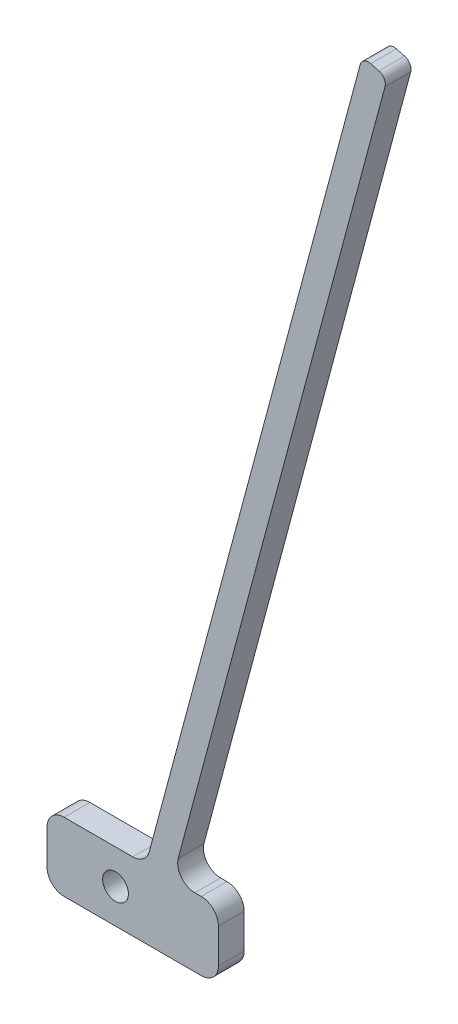
ISO-10303-21;
HEADER;
FILE_DESCRIPTION(('STEP AP214'),'2;1');
FILE_NAME('part.step','',(''),(''),'','','');
FILE_SCHEMA(('AUTOMOTIVE_DESIGN { 1 0 10303 214 1 1 1 1 }'));
ENDSEC;
DATA;
#1=APPLICATION_CONTEXT('core data for automotive mechanical design processes');
#2=APPLICATION_PROTOCOL_DEFINITION('international standard','automotive_design',2000,#1);
#3=PRODUCT_CONTEXT('',#1,'mechanical');
#4=PRODUCT('Part','Part','',(#3));
#5=PRODUCT_RELATED_PRODUCT_CATEGORY('part','',(#4));
#6=PRODUCT_DEFINITION_FORMATION('','',#4);
#7=PRODUCT_DEFINITION_CONTEXT('part definition',#1,'design');
#8=PRODUCT_DEFINITION('design','',#6,#7);
#9=PRODUCT_DEFINITION_SHAPE('','',#8);
#10=(LENGTH_UNIT() NAMED_UNIT(*) SI_UNIT(.MILLI.,.METRE.));
#11=(NAMED_UNIT(*) PLANE_ANGLE_UNIT() SI_UNIT($,.RADIAN.));
#12=(NAMED_UNIT(*) SI_UNIT($,.STERADIAN.) SOLID_ANGLE_UNIT());
#13=UNCERTAINTY_MEASURE_WITH_UNIT(LENGTH_MEASURE(1.E-05),#10,'distance_accuracy_value','');
#14=(GEOMETRIC_REPRESENTATION_CONTEXT(3) GLOBAL_UNCERTAINTY_ASSIGNED_CONTEXT((#13)) GLOBAL_UNIT_ASSIGNED_CONTEXT((#10,
#11,#12)) REPRESENTATION_CONTEXT('',''));
#15=CARTESIAN_POINT('',(0.,0.,0.));
#16=DIRECTION('',(0.,0.,1.));
#17=DIRECTION('',(1.,0.,0.));
#18=AXIS2_PLACEMENT_3D('',#15,#16,#17);
#19=CARTESIAN_POINT('',(-1.53465397595791,2.,3.));
#20=DIRECTION('',(0.,0.,-1.));
#21=DIRECTION('',(-1.,0.,0.));
#22=AXIS2_PLACEMENT_3D('',#19,#20,#21);
#23=PLANE('',#22);
#24=CARTESIAN_POINT('',(-1.53465397595791,2.,3.));
#25=DIRECTION('',(0.,0.,-1.));
#26=DIRECTION('',(-1.,0.,0.));
#27=AXIS2_PLACEMENT_3D('',#24,#25,#26);
#28=CIRCLE('',#27,2.);
#29=CARTESIAN_POINT('',(0.397197676620228,1.48236190979495,3.));
#30=VERTEX_POINT('',#29);
#31=CARTESIAN_POINT('',(-1.53465397595791,0.,3.));
#32=VERTEX_POINT('',#31);
#33=EDGE_CURVE('E236',#30,#32,#28,.T.);
#34=ORIENTED_EDGE('',*,*,#33,.T.);
#35=DIRECTION('',(-1.,0.,0.));
#36=VECTOR('',#35,1.);
#37=CARTESIAN_POINT('',(-1.53465397595791,0.,3.));
#38=LINE('',#37,#36);
#39=CARTESIAN_POINT('',(-9.53465397595791,0.,3.));
#40=VERTEX_POINT('',#39);
#41=EDGE_CURVE('E124',#32,#40,#38,.T.);
#42=ORIENTED_EDGE('',*,*,#41,.T.);
#43=CARTESIAN_POINT('',(-9.53465397595791,-2.,3.));
#44=DIRECTION('',(0.,0.,1.));
#45=DIRECTION('',(-1.,0.,0.));
#46=AXIS2_PLACEMENT_3D('',#43,#44,#45);
#47=CIRCLE('',#46,2.);
#48=CARTESIAN_POINT('',(-11.5346539759579,-2.,3.));
#49=VERTEX_POINT('',#48);
#50=EDGE_CURVE('E289',#40,#49,#47,.T.);
#51=ORIENTED_EDGE('',*,*,#50,.T.);
#52=DIRECTION('',(0.,-1.,0.));
#53=VECTOR('',#52,1.);
#54=CARTESIAN_POINT('',(-11.5346539759579,-2.,3.));
#55=LINE('',#54,#53);
#56=CARTESIAN_POINT('',(-11.5346539759579,-6.,3.));
#57=VERTEX_POINT('',#56);
#58=EDGE_CURVE('E309',#49,#57,#55,.T.);
#59=ORIENTED_EDGE('',*,*,#58,.T.);
#60=CARTESIAN_POINT('',(-9.53465397595791,-6.,3.));
#61=DIRECTION('',(0.,0.,1.));
#62=DIRECTION('',(-1.,0.,0.));
#63=AXIS2_PLACEMENT_3D('',#60,#61,#62);
#64=CIRCLE('',#63,2.);
#65=CARTESIAN_POINT('',(-9.53465397595791,-8.,3.));
#66=VERTEX_POINT('',#65);
#67=EDGE_CURVE('E305',#57,#66,#64,.T.);
#68=ORIENTED_EDGE('',*,*,#67,.T.);
#69=DIRECTION('',(1.,0.,0.));
#70=VECTOR('',#69,1.);
#71=CARTESIAN_POINT('',(-9.53465397595791,-8.,3.));
#72=LINE('',#71,#70);
#73=CARTESIAN_POINT('',(6.46534602404209,-8.,3.));
#74=VERTEX_POINT('',#73);
#75=EDGE_CURVE('E308',#66,#74,#72,.T.);
#76=ORIENTED_EDGE('',*,*,#75,.T.);
#77=CARTESIAN_POINT('',(6.46534602404209,-6.,3.));
#78=DIRECTION('',(0.,0.,1.));
#79=DIRECTION('',(-1.,0.,0.));
#80=AXIS2_PLACEMENT_3D('',#77,#78,#79);
#81=CIRCLE('',#80,2.);
#82=CARTESIAN_POINT('',(8.46534602404209,-6.,3.));
#83=VERTEX_POINT('',#82);
#84=EDGE_CURVE('E313',#74,#83,#81,.T.);
#85=ORIENTED_EDGE('',*,*,#84,.T.);
#86=DIRECTION('',(0.,1.,0.));
#87=VECTOR('',#86,1.);
#88=CARTESIAN_POINT('',(8.46534602404209,-6.,3.));
#89=LINE('',#88,#87);
#90=CARTESIAN_POINT('',(8.46534602404209,-2.,3.));
#91=VERTEX_POINT('',#90);
#92=EDGE_CURVE('E320',#83,#91,#89,.T.);
#93=ORIENTED_EDGE('',*,*,#92,.T.);
#94=CARTESIAN_POINT('',(6.46534602404209,-2.,3.));
#95=DIRECTION('',(0.,0.,1.));
#96=DIRECTION('',(-1.,0.,0.));
#97=AXIS2_PLACEMENT_3D('',#94,#95,#96);
#98=CIRCLE('',#97,2.);
#99=CARTESIAN_POINT('',(6.46534602404209,0.,3.));
#100=VERTEX_POINT('',#99);
#101=EDGE_CURVE('E323',#91,#100,#98,.T.);
#102=ORIENTED_EDGE('',*,*,#101,.T.);
#103=DIRECTION('',(-1.,0.,0.));
#104=VECTOR('',#103,1.);
#105=CARTESIAN_POINT('',(6.46534602404209,0.,3.));
#106=LINE('',#105,#104);
#107=CARTESIAN_POINT('',(5.71227928691264,0.,3.));
#108=VERTEX_POINT('',#107);
#109=EDGE_CURVE('E326',#100,#108,#106,.T.);
#110=ORIENTED_EDGE('',*,*,#109,.T.);
#111=CARTESIAN_POINT('',(5.71227928691264,2.,3.));
#112=DIRECTION('',(0.,0.,-1.));
#113=DIRECTION('',(1.,0.,0.));
#114=AXIS2_PLACEMENT_3D('',#111,#112,#113);
#115=CIRCLE('',#114,2.);
#116=CARTESIAN_POINT('',(3.78042763433451,2.51763809020505,3.));
#117=VERTEX_POINT('',#116);
#118=EDGE_CURVE('E329',#108,#117,#115,.T.);
#119=ORIENTED_EDGE('',*,*,#118,.T.);
#120=DIRECTION('',(0.258819045102525,0.965925826289067,0.));
#121=VECTOR('',#120,1.);
#122=CARTESIAN_POINT('',(3.78042763433451,2.51763809020505,3.));
#123=LINE('',#122,#121);
#124=CARTESIAN_POINT('',(27.8958549531359,92.5176380902051,3.));
#125=VERTEX_POINT('',#124);
#126=EDGE_CURVE('E332',#117,#125,#123,.T.);
#127=ORIENTED_EDGE('',*,*,#126,.T.);
#128=CARTESIAN_POINT('',(26.9299291268469,92.7764571353076,3.));
#129=DIRECTION('',(0.,0.,1.));
#130=DIRECTION('',(1.,0.,0.));
#131=AXIS2_PLACEMENT_3D('',#128,#129,#130);
#132=CIRCLE('',#131,0.999999999999996);
#133=CARTESIAN_POINT('',(27.1887481719494,93.7423829615966,3.));
#134=VERTEX_POINT('',#133);
#135=EDGE_CURVE('E167',#125,#134,#132,.T.);
#136=ORIENTED_EDGE('',*,*,#135,.T.);
#137=DIRECTION('',(-0.965925826289067,0.258819045102524,0.));
#138=VECTOR('',#137,1.);
#139=CARTESIAN_POINT('',(27.1887481719494,93.7423829615966,3.));
#140=LINE('',#139,#138);
#141=CARTESIAN_POINT('',(26.2228223456604,94.0012020066991,3.));
#142=VERTEX_POINT('',#141);
#143=EDGE_CURVE('E161',#134,#142,#140,.T.);
#144=ORIENTED_EDGE('',*,*,#143,.T.);
#145=CARTESIAN_POINT('',(25.9640033005578,93.0352761804101,3.));
#146=DIRECTION('',(0.,0.,1.));
#147=DIRECTION('',(1.,0.,0.));
#148=AXIS2_PLACEMENT_3D('',#145,#146,#147);
#149=CIRCLE('',#148,1.);
#150=CARTESIAN_POINT('',(24.9980774742688,93.2940952255126,3.));
#151=VERTEX_POINT('',#150);
#152=EDGE_CURVE('E165',#142,#151,#149,.T.);
#153=ORIENTED_EDGE('',*,*,#152,.T.);
#154=DIRECTION('',(-0.258819045102525,-0.965925826289067,0.));
#155=VECTOR('',#154,1.);
#156=CARTESIAN_POINT('',(24.9980774742688,93.2940952255126,3.));
#157=LINE('',#156,#155);
#158=EDGE_CURVE('E57',#151,#30,#157,.T.);
#159=ORIENTED_EDGE('',*,*,#158,.T.);
#160=EDGE_LOOP('',(#34,#42,#51,#59,#68,#76,#85,#93,#102,#110,#119,#127,#136,#144,#153,#159));
#161=FACE_BOUND('',#160,.T.);
#162=CARTESIAN_POINT('',(-3.53465397595792,-4.,3.));
#163=DIRECTION('',(0.,0.,1.));
#164=DIRECTION('',(1.,0.,0.));
#165=AXIS2_PLACEMENT_3D('',#162,#163,#164);
#166=CIRCLE('',#165,1.5);
#167=CARTESIAN_POINT('',(-2.03465397595791,-4.,3.));
#168=VERTEX_POINT('',#167);
#169=EDGE_CURVE('E194',#168,#168,#166,.T.);
#170=ORIENTED_EDGE('',*,*,#169,.F.);
#171=EDGE_LOOP('',(#170));
#172=FACE_BOUND('',#171,.T.);
#173=ADVANCED_FACE('F39',(#161,#172),#23,.F.);
#174=CARTESIAN_POINT('',(-1.53465397595791,2.,0.));
#175=DIRECTION('',(0.,0.,-1.));
#176=DIRECTION('',(-1.,0.,0.));
#177=AXIS2_PLACEMENT_3D('',#174,#175,#176);
#178=PLANE('',#177);
#179=CARTESIAN_POINT('',(-1.53465397595791,2.,0.));
#180=DIRECTION('',(0.,0.,-1.));
#181=DIRECTION('',(-1.,0.,0.));
#182=AXIS2_PLACEMENT_3D('',#179,#180,#181);
#183=CIRCLE('',#182,2.);
#184=CARTESIAN_POINT('',(0.397197676620228,1.48236190979495,0.));
#185=VERTEX_POINT('',#184);
#186=CARTESIAN_POINT('',(-1.53465397595791,0.,0.));
#187=VERTEX_POINT('',#186);
#188=EDGE_CURVE('E189',#185,#187,#183,.T.);
#189=ORIENTED_EDGE('',*,*,#188,.F.);
#190=DIRECTION('',(-0.258819045102525,-0.965925826289067,0.));
#191=VECTOR('',#190,1.);
#192=CARTESIAN_POINT('',(24.9980774742688,93.2940952255126,0.));
#193=LINE('',#192,#191);
#194=CARTESIAN_POINT('',(24.9980774742688,93.2940952255126,0.));
#195=VERTEX_POINT('',#194);
#196=EDGE_CURVE('E116',#195,#185,#193,.T.);
#197=ORIENTED_EDGE('',*,*,#196,.F.);
#198=CARTESIAN_POINT('',(25.9640033005578,93.0352761804101,0.));
#199=DIRECTION('',(0.,0.,1.));
#200=DIRECTION('',(1.,0.,0.));
#201=AXIS2_PLACEMENT_3D('',#198,#199,#200);
#202=CIRCLE('',#201,1.);
#203=CARTESIAN_POINT('',(26.2228223456604,94.0012020066991,0.));
#204=VERTEX_POINT('',#203);
#205=EDGE_CURVE('E110',#204,#195,#202,.T.);
#206=ORIENTED_EDGE('',*,*,#205,.F.);
#207=DIRECTION('',(-0.965925826289067,0.258819045102524,0.));
#208=VECTOR('',#207,1.);
#209=CARTESIAN_POINT('',(27.1887481719494,93.7423829615966,0.));
#210=LINE('',#209,#208);
#211=CARTESIAN_POINT('',(27.1887481719494,93.7423829615966,0.));
#212=VERTEX_POINT('',#211);
#213=EDGE_CURVE('E176',#212,#204,#210,.T.);
#214=ORIENTED_EDGE('',*,*,#213,.F.);
#215=CARTESIAN_POINT('',(26.9299291268469,92.7764571353076,0.));
#216=DIRECTION('',(0.,0.,1.));
#217=DIRECTION('',(1.,0.,0.));
#218=AXIS2_PLACEMENT_3D('',#215,#216,#217);
#219=CIRCLE('',#218,0.999999999999996);
#220=CARTESIAN_POINT('',(27.8958549531359,92.5176380902051,0.));
#221=VERTEX_POINT('',#220);
#222=EDGE_CURVE('E227',#221,#212,#219,.T.);
#223=ORIENTED_EDGE('',*,*,#222,.F.);
#224=DIRECTION('',(0.258819045102525,0.965925826289067,0.));
#225=VECTOR('',#224,1.);
#226=CARTESIAN_POINT('',(3.78042763433451,2.51763809020505,0.));
#227=LINE('',#226,#225);
#228=CARTESIAN_POINT('',(3.78042763433451,2.51763809020505,0.));
#229=VERTEX_POINT('',#228);
#230=EDGE_CURVE('E224',#229,#221,#227,.T.);
#231=ORIENTED_EDGE('',*,*,#230,.F.);
#232=CARTESIAN_POINT('',(5.71227928691264,2.,0.));
#233=DIRECTION('',(0.,0.,-1.));
#234=DIRECTION('',(1.,0.,0.));
#235=AXIS2_PLACEMENT_3D('',#232,#233,#234);
#236=CIRCLE('',#235,2.);
#237=CARTESIAN_POINT('',(5.71227928691264,0.,0.));
#238=VERTEX_POINT('',#237);
#239=EDGE_CURVE('E221',#238,#229,#236,.T.);
#240=ORIENTED_EDGE('',*,*,#239,.F.);
#241=DIRECTION('',(-1.,0.,0.));
#242=VECTOR('',#241,1.);
#243=CARTESIAN_POINT('',(6.46534602404209,0.,0.));
#244=LINE('',#243,#242);
#245=CARTESIAN_POINT('',(6.46534602404209,0.,0.));
#246=VERTEX_POINT('',#245);
#247=EDGE_CURVE('E218',#246,#238,#244,.T.);
#248=ORIENTED_EDGE('',*,*,#247,.F.);
#249=CARTESIAN_POINT('',(6.46534602404209,-2.,0.));
#250=DIRECTION('',(0.,0.,1.));
#251=DIRECTION('',(-1.,0.,0.));
#252=AXIS2_PLACEMENT_3D('',#249,#250,#251);
#253=CIRCLE('',#252,2.);
#254=CARTESIAN_POINT('',(8.46534602404209,-2.,0.));
#255=VERTEX_POINT('',#254);
#256=EDGE_CURVE('E215',#255,#246,#253,.T.);
#257=ORIENTED_EDGE('',*,*,#256,.F.);
#258=DIRECTION('',(0.,1.,0.));
#259=VECTOR('',#258,1.);
#260=CARTESIAN_POINT('',(8.46534602404209,-6.,0.));
#261=LINE('',#260,#259);
#262=CARTESIAN_POINT('',(8.46534602404209,-6.,0.));
#263=VERTEX_POINT('',#262);
#264=EDGE_CURVE('E212',#263,#255,#261,.T.);
#265=ORIENTED_EDGE('',*,*,#264,.F.);
#266=CARTESIAN_POINT('',(6.46534602404209,-6.,0.));
#267=DIRECTION('',(0.,0.,1.));
#268=DIRECTION('',(-1.,0.,0.));
#269=AXIS2_PLACEMENT_3D('',#266,#267,#268);
#270=CIRCLE('',#269,2.);
#271=CARTESIAN_POINT('',(6.46534602404209,-8.,0.));
#272=VERTEX_POINT('',#271);
#273=EDGE_CURVE('E209',#272,#263,#270,.T.);
#274=ORIENTED_EDGE('',*,*,#273,.F.);
#275=DIRECTION('',(1.,0.,0.));
#276=VECTOR('',#275,1.);
#277=CARTESIAN_POINT('',(-9.53465397595791,-8.,0.));
#278=LINE('',#277,#276);
#279=CARTESIAN_POINT('',(-9.53465397595791,-8.,0.));
#280=VERTEX_POINT('',#279);
#281=EDGE_CURVE('E206',#280,#272,#278,.T.);
#282=ORIENTED_EDGE('',*,*,#281,.F.);
#283=CARTESIAN_POINT('',(-9.53465397595791,-6.,0.));
#284=DIRECTION('',(0.,0.,1.));
#285=DIRECTION('',(-1.,0.,0.));
#286=AXIS2_PLACEMENT_3D('',#283,#284,#285);
#287=CIRCLE('',#286,2.);
#288=CARTESIAN_POINT('',(-11.5346539759579,-6.,0.));
#289=VERTEX_POINT('',#288);
#290=EDGE_CURVE('E203',#289,#280,#287,.T.);
#291=ORIENTED_EDGE('',*,*,#290,.F.);
#292=DIRECTION('',(0.,-1.,0.));
#293=VECTOR('',#292,1.);
#294=CARTESIAN_POINT('',(-11.5346539759579,-2.,0.));
#295=LINE('',#294,#293);
#296=CARTESIAN_POINT('',(-11.5346539759579,-2.,0.));
#297=VERTEX_POINT('',#296);
#298=EDGE_CURVE('E200',#297,#289,#295,.T.);
#299=ORIENTED_EDGE('',*,*,#298,.F.);
#300=CARTESIAN_POINT('',(-9.53465397595791,-2.,0.));
#301=DIRECTION('',(0.,0.,1.));
#302=DIRECTION('',(-1.,0.,0.));
#303=AXIS2_PLACEMENT_3D('',#300,#301,#302);
#304=CIRCLE('',#303,2.);
#305=CARTESIAN_POINT('',(-9.53465397595791,0.,0.));
#306=VERTEX_POINT('',#305);
#307=EDGE_CURVE('E197',#306,#297,#304,.T.);
#308=ORIENTED_EDGE('',*,*,#307,.F.);
#309=DIRECTION('',(-1.,0.,0.));
#310=VECTOR('',#309,1.);
#311=CARTESIAN_POINT('',(-1.53465397595791,0.,0.));
#312=LINE('',#311,#310);
#313=EDGE_CURVE('E193',#187,#306,#312,.T.);
#314=ORIENTED_EDGE('',*,*,#313,.F.);
#315=EDGE_LOOP('',(#189,#197,#206,#214,#223,#231,#240,#248,#257,#265,#274,#282,#291,#299,#308,#314));
#316=FACE_BOUND('',#315,.T.);
#317=CARTESIAN_POINT('',(-3.53465397595792,-4.,0.));
#318=DIRECTION('',(0.,0.,1.));
#319=DIRECTION('',(1.,0.,0.));
#320=AXIS2_PLACEMENT_3D('',#317,#318,#319);
#321=CIRCLE('',#320,1.5);
#322=CARTESIAN_POINT('',(-2.03465397595791,-4.,0.));
#323=VERTEX_POINT('',#322);
#324=EDGE_CURVE('E533',#323,#323,#321,.T.);
#325=ORIENTED_EDGE('',*,*,#324,.T.);
#326=EDGE_LOOP('',(#325));
#327=FACE_BOUND('',#326,.T.);
#328=ADVANCED_FACE('F293',(#316,#327),#178,.T.);
#329=CARTESIAN_POINT('',(-1.53465397595791,2.,3.));
#330=DIRECTION('',(0.,0.,-1.));
#331=DIRECTION('',(-1.,0.,0.));
#332=AXIS2_PLACEMENT_3D('',#329,#330,#331);
#333=CYLINDRICAL_SURFACE('',#332,2.);
#334=ORIENTED_EDGE('',*,*,#188,.T.);
#335=DIRECTION('',(0.,0.,-1.));
#336=VECTOR('',#335,1.);
#337=CARTESIAN_POINT('',(-1.53465397595791,0.,3.));
#338=LINE('',#337,#336);
#339=EDGE_CURVE('E11',#32,#187,#338,.T.);
#340=ORIENTED_EDGE('',*,*,#339,.F.);
#341=ORIENTED_EDGE('',*,*,#33,.F.);
#342=DIRECTION('',(0.,0.,-1.));
#343=VECTOR('',#342,1.);
#344=CARTESIAN_POINT('',(0.397197676620228,1.48236190979495,3.));
#345=LINE('',#344,#343);
#346=EDGE_CURVE('E185',#30,#185,#345,.T.);
#347=ORIENTED_EDGE('',*,*,#346,.T.);
#348=EDGE_LOOP('',(#334,#340,#341,#347));
#349=FACE_BOUND('',#348,.T.);
#350=ADVANCED_FACE('F41',(#349),#333,.F.);
#351=CARTESIAN_POINT('',(-1.53465397595791,0.,3.));
#352=DIRECTION('',(0.,-1.,0.));
#353=DIRECTION('',(1.,0.,0.));
#354=AXIS2_PLACEMENT_3D('',#351,#352,#353);
#355=PLANE('',#354);
#356=ORIENTED_EDGE('',*,*,#313,.T.);
#357=DIRECTION('',(0.,0.,-1.));
#358=VECTOR('',#357,1.);
#359=CARTESIAN_POINT('',(-9.53465397595791,0.,3.));
#360=LINE('',#359,#358);
#361=EDGE_CURVE('E49',#40,#306,#360,.T.);
#362=ORIENTED_EDGE('',*,*,#361,.F.);
#363=ORIENTED_EDGE('',*,*,#41,.F.);
#364=ORIENTED_EDGE('',*,*,#339,.T.);
#365=EDGE_LOOP('',(#356,#362,#363,#364));
#366=FACE_BOUND('',#365,.T.);
#367=ADVANCED_FACE('F368',(#366),#355,.F.);
#368=CARTESIAN_POINT('',(-9.53465397595791,-2.,3.));
#369=DIRECTION('',(0.,0.,-1.));
#370=DIRECTION('',(-1.,0.,0.));
#371=AXIS2_PLACEMENT_3D('',#368,#369,#370);
#372=CYLINDRICAL_SURFACE('',#371,2.);
#373=ORIENTED_EDGE('',*,*,#307,.T.);
#374=DIRECTION('',(0.,0.,-1.));
#375=VECTOR('',#374,1.);
#376=CARTESIAN_POINT('',(-11.5346539759579,-2.,3.));
#377=LINE('',#376,#375);
#378=EDGE_CURVE('E279',#49,#297,#377,.T.);
#379=ORIENTED_EDGE('',*,*,#378,.F.);
#380=ORIENTED_EDGE('',*,*,#50,.F.);
#381=ORIENTED_EDGE('',*,*,#361,.T.);
#382=EDGE_LOOP('',(#373,#379,#380,#381));
#383=FACE_BOUND('',#382,.T.);
#384=ADVANCED_FACE('F287',(#383),#372,.T.);
#385=CARTESIAN_POINT('',(-11.5346539759579,-2.,3.));
#386=DIRECTION('',(1.,0.,0.));
#387=DIRECTION('',(0.,0.,-1.));
#388=AXIS2_PLACEMENT_3D('',#385,#386,#387);
#389=PLANE('',#388);
#390=ORIENTED_EDGE('',*,*,#298,.T.);
#391=DIRECTION('',(0.,0.,-1.));
#392=VECTOR('',#391,1.);
#393=CARTESIAN_POINT('',(-11.5346539759579,-6.,3.));
#394=LINE('',#393,#392);
#395=EDGE_CURVE('E275',#57,#289,#394,.T.);
#396=ORIENTED_EDGE('',*,*,#395,.F.);
#397=ORIENTED_EDGE('',*,*,#58,.F.);
#398=ORIENTED_EDGE('',*,*,#378,.T.);
#399=EDGE_LOOP('',(#390,#396,#397,#398));
#400=FACE_BOUND('',#399,.T.);
#401=ADVANCED_FACE('F299',(#400),#389,.F.);
#402=CARTESIAN_POINT('',(-9.53465397595791,-6.,3.));
#403=DIRECTION('',(0.,0.,-1.));
#404=DIRECTION('',(-1.,0.,0.));
#405=AXIS2_PLACEMENT_3D('',#402,#403,#404);
#406=CYLINDRICAL_SURFACE('',#405,2.);
#407=ORIENTED_EDGE('',*,*,#290,.T.);
#408=DIRECTION('',(0.,0.,-1.));
#409=VECTOR('',#408,1.);
#410=CARTESIAN_POINT('',(-9.53465397595791,-8.,3.));
#411=LINE('',#410,#409);
#412=EDGE_CURVE('E271',#66,#280,#411,.T.);
#413=ORIENTED_EDGE('',*,*,#412,.F.);
#414=ORIENTED_EDGE('',*,*,#67,.F.);
#415=ORIENTED_EDGE('',*,*,#395,.T.);
#416=EDGE_LOOP('',(#407,#413,#414,#415));
#417=FACE_BOUND('',#416,.T.);
#418=ADVANCED_FACE('F303',(#417),#406,.T.);
#419=CARTESIAN_POINT('',(-9.53465397595791,-8.,3.));
#420=DIRECTION('',(0.,1.,0.));
#421=DIRECTION('',(0.,0.,1.));
#422=AXIS2_PLACEMENT_3D('',#419,#420,#421);
#423=PLANE('',#422);
#424=ORIENTED_EDGE('',*,*,#281,.T.);
#425=DIRECTION('',(0.,0.,-1.));
#426=VECTOR('',#425,1.);
#427=CARTESIAN_POINT('',(6.46534602404209,-8.,3.));
#428=LINE('',#427,#426);
#429=EDGE_CURVE('E267',#74,#272,#428,.T.);
#430=ORIENTED_EDGE('',*,*,#429,.F.);
#431=ORIENTED_EDGE('',*,*,#75,.F.);
#432=ORIENTED_EDGE('',*,*,#412,.T.);
#433=EDGE_LOOP('',(#424,#430,#431,#432));
#434=FACE_BOUND('',#433,.T.);
#435=ADVANCED_FACE('F381',(#434),#423,.F.);
#436=CARTESIAN_POINT('',(6.46534602404209,-6.,3.));
#437=DIRECTION('',(0.,0.,-1.));
#438=DIRECTION('',(-1.,0.,0.));
#439=AXIS2_PLACEMENT_3D('',#436,#437,#438);
#440=CYLINDRICAL_SURFACE('',#439,2.);
#441=ORIENTED_EDGE('',*,*,#273,.T.);
#442=DIRECTION('',(0.,0.,-1.));
#443=VECTOR('',#442,1.);
#444=CARTESIAN_POINT('',(8.46534602404209,-6.,3.));
#445=LINE('',#444,#443);
#446=EDGE_CURVE('E263',#83,#263,#445,.T.);
#447=ORIENTED_EDGE('',*,*,#446,.F.);
#448=ORIENTED_EDGE('',*,*,#84,.F.);
#449=ORIENTED_EDGE('',*,*,#429,.T.);
#450=EDGE_LOOP('',(#441,#447,#448,#449));
#451=FACE_BOUND('',#450,.T.);
#452=ADVANCED_FACE('F384',(#451),#440,.T.);
#453=CARTESIAN_POINT('',(8.46534602404209,-6.,3.));
#454=DIRECTION('',(-1.,0.,0.));
#455=DIRECTION('',(0.,-1.,0.));
#456=AXIS2_PLACEMENT_3D('',#453,#454,#455);
#457=PLANE('',#456);
#458=ORIENTED_EDGE('',*,*,#264,.T.);
#459=DIRECTION('',(0.,0.,-1.));
#460=VECTOR('',#459,1.);
#461=CARTESIAN_POINT('',(8.46534602404209,-2.,3.));
#462=LINE('',#461,#460);
#463=EDGE_CURVE('E259',#91,#255,#462,.T.);
#464=ORIENTED_EDGE('',*,*,#463,.F.);
#465=ORIENTED_EDGE('',*,*,#92,.F.);
#466=ORIENTED_EDGE('',*,*,#446,.T.);
#467=EDGE_LOOP('',(#458,#464,#465,#466));
#468=FACE_BOUND('',#467,.T.);
#469=ADVANCED_FACE('F388',(#468),#457,.F.);
#470=CARTESIAN_POINT('',(6.46534602404209,-2.,3.));
#471=DIRECTION('',(0.,0.,-1.));
#472=DIRECTION('',(-1.,0.,0.));
#473=AXIS2_PLACEMENT_3D('',#470,#471,#472);
#474=CYLINDRICAL_SURFACE('',#473,2.);
#475=ORIENTED_EDGE('',*,*,#256,.T.);
#476=DIRECTION('',(0.,0.,-1.));
#477=VECTOR('',#476,1.);
#478=CARTESIAN_POINT('',(6.46534602404209,0.,3.));
#479=LINE('',#478,#477);
#480=EDGE_CURVE('E255',#100,#246,#479,.T.);
#481=ORIENTED_EDGE('',*,*,#480,.F.);
#482=ORIENTED_EDGE('',*,*,#101,.F.);
#483=ORIENTED_EDGE('',*,*,#463,.T.);
#484=EDGE_LOOP('',(#475,#481,#482,#483));
#485=FACE_BOUND('',#484,.T.);
#486=ADVANCED_FACE('F392',(#485),#474,.T.);
#487=CARTESIAN_POINT('',(6.46534602404209,0.,3.));
#488=DIRECTION('',(0.,-1.,0.));
#489=DIRECTION('',(0.,0.,-1.));
#490=AXIS2_PLACEMENT_3D('',#487,#488,#489);
#491=PLANE('',#490);
#492=ORIENTED_EDGE('',*,*,#247,.T.);
#493=DIRECTION('',(0.,0.,-1.));
#494=VECTOR('',#493,1.);
#495=CARTESIAN_POINT('',(5.71227928691264,0.,3.));
#496=LINE('',#495,#494);
#497=EDGE_CURVE('E251',#108,#238,#496,.T.);
#498=ORIENTED_EDGE('',*,*,#497,.F.);
#499=ORIENTED_EDGE('',*,*,#109,.F.);
#500=ORIENTED_EDGE('',*,*,#480,.T.);
#501=EDGE_LOOP('',(#492,#498,#499,#500));
#502=FACE_BOUND('',#501,.T.);
#503=ADVANCED_FACE('F396',(#502),#491,.F.);
#504=CARTESIAN_POINT('',(5.71227928691264,2.,3.));
#505=DIRECTION('',(0.,0.,-1.));
#506=DIRECTION('',(-1.,0.,0.));
#507=AXIS2_PLACEMENT_3D('',#504,#505,#506);
#508=CYLINDRICAL_SURFACE('',#507,2.);
#509=ORIENTED_EDGE('',*,*,#239,.T.);
#510=DIRECTION('',(0.,0.,-1.));
#511=VECTOR('',#510,1.);
#512=CARTESIAN_POINT('',(3.78042763433451,2.51763809020505,3.));
#513=LINE('',#512,#511);
#514=EDGE_CURVE('E247',#117,#229,#513,.T.);
#515=ORIENTED_EDGE('',*,*,#514,.F.);
#516=ORIENTED_EDGE('',*,*,#118,.F.);
#517=ORIENTED_EDGE('',*,*,#497,.T.);
#518=EDGE_LOOP('',(#509,#515,#516,#517));
#519=FACE_BOUND('',#518,.T.);
#520=ADVANCED_FACE('F400',(#519),#508,.F.);
#521=CARTESIAN_POINT('',(3.78042763433451,2.51763809020505,3.));
#522=DIRECTION('',(-0.965925826289067,0.258819045102525,0.));
#523=DIRECTION('',(-0.258819045102525,-0.965925826289067,0.));
#524=AXIS2_PLACEMENT_3D('',#521,#522,#523);
#525=PLANE('',#524);
#526=ORIENTED_EDGE('',*,*,#230,.T.);
#527=DIRECTION('',(0.,0.,-1.));
#528=VECTOR('',#527,1.);
#529=CARTESIAN_POINT('',(27.8958549531359,92.5176380902051,3.));
#530=LINE('',#529,#528);
#531=EDGE_CURVE('E243',#125,#221,#530,.T.);
#532=ORIENTED_EDGE('',*,*,#531,.F.);
#533=ORIENTED_EDGE('',*,*,#126,.F.);
#534=ORIENTED_EDGE('',*,*,#514,.T.);
#535=EDGE_LOOP('',(#526,#532,#533,#534));
#536=FACE_BOUND('',#535,.T.);
#537=ADVANCED_FACE('F340',(#536),#525,.F.);
#538=CARTESIAN_POINT('',(26.9299291268469,92.7764571353076,3.));
#539=DIRECTION('',(0.,0.,-1.));
#540=DIRECTION('',(-1.,0.,0.));
#541=AXIS2_PLACEMENT_3D('',#538,#539,#540);
#542=CYLINDRICAL_SURFACE('',#541,0.999999999999996);
#543=ORIENTED_EDGE('',*,*,#222,.T.);
#544=DIRECTION('',(0.,0.,-1.));
#545=VECTOR('',#544,1.);
#546=CARTESIAN_POINT('',(27.1887481719494,93.7423829615966,3.));
#547=LINE('',#546,#545);
#548=EDGE_CURVE('E178',#134,#212,#547,.T.);
#549=ORIENTED_EDGE('',*,*,#548,.F.);
#550=ORIENTED_EDGE('',*,*,#135,.F.);
#551=ORIENTED_EDGE('',*,*,#531,.T.);
#552=EDGE_LOOP('',(#543,#549,#550,#551));
#553=FACE_BOUND('',#552,.T.);
#554=ADVANCED_FACE('F344',(#553),#542,.T.);
#555=CARTESIAN_POINT('',(27.1887481719494,93.7423829615966,3.));
#556=DIRECTION('',(-0.258819045102524,-0.965925826289067,0.));
#557=DIRECTION('',(0.965925826289067,-0.258819045102524,0.));
#558=AXIS2_PLACEMENT_3D('',#555,#556,#557);
#559=PLANE('',#558);
#560=ORIENTED_EDGE('',*,*,#213,.T.);
#561=DIRECTION('',(0.,0.,-1.));
#562=VECTOR('',#561,1.);
#563=CARTESIAN_POINT('',(26.2228223456604,94.0012020066991,3.));
#564=LINE('',#563,#562);
#565=EDGE_CURVE('E173',#142,#204,#564,.T.);
#566=ORIENTED_EDGE('',*,*,#565,.F.);
#567=ORIENTED_EDGE('',*,*,#143,.F.);
#568=ORIENTED_EDGE('',*,*,#548,.T.);
#569=EDGE_LOOP('',(#560,#566,#567,#568));
#570=FACE_BOUND('',#569,.T.);
#571=ADVANCED_FACE('F174',(#570),#559,.F.);
#572=CARTESIAN_POINT('',(25.9640033005578,93.0352761804101,3.));
#573=DIRECTION('',(0.,0.,-1.));
#574=DIRECTION('',(-1.,0.,0.));
#575=AXIS2_PLACEMENT_3D('',#572,#573,#574);
#576=CYLINDRICAL_SURFACE('',#575,1.);
#577=ORIENTED_EDGE('',*,*,#205,.T.);
#578=DIRECTION('',(0.,0.,-1.));
#579=VECTOR('',#578,1.);
#580=CARTESIAN_POINT('',(24.9980774742688,93.2940952255126,3.));
#581=LINE('',#580,#579);
#582=EDGE_CURVE('E179',#151,#195,#581,.T.);
#583=ORIENTED_EDGE('',*,*,#582,.F.);
#584=ORIENTED_EDGE('',*,*,#152,.F.);
#585=ORIENTED_EDGE('',*,*,#565,.T.);
#586=EDGE_LOOP('',(#577,#583,#584,#585));
#587=FACE_BOUND('',#586,.T.);
#588=ADVANCED_FACE('F181',(#587),#576,.T.);
#589=CARTESIAN_POINT('',(24.9980774742688,93.2940952255126,3.));
#590=DIRECTION('',(0.965925826289067,-0.258819045102525,0.));
#591=DIRECTION('',(0.258819045102525,0.965925826289067,0.));
#592=AXIS2_PLACEMENT_3D('',#589,#590,#591);
#593=PLANE('',#592);
#594=ORIENTED_EDGE('',*,*,#196,.T.);
#595=ORIENTED_EDGE('',*,*,#346,.F.);
#596=ORIENTED_EDGE('',*,*,#158,.F.);
#597=ORIENTED_EDGE('',*,*,#582,.T.);
#598=EDGE_LOOP('',(#594,#595,#596,#597));
#599=FACE_BOUND('',#598,.T.);
#600=ADVANCED_FACE('F348',(#599),#593,.F.);
#601=CARTESIAN_POINT('',(-3.53465397595792,-4.,3.));
#602=DIRECTION('',(0.,0.,-1.));
#603=DIRECTION('',(-1.,0.,0.));
#604=AXIS2_PLACEMENT_3D('',#601,#602,#603);
#605=CYLINDRICAL_SURFACE('',#604,1.5);
#606=ORIENTED_EDGE('',*,*,#169,.T.);
#607=EDGE_LOOP('',(#606));
#608=FACE_BOUND('',#607,.T.);
#609=ORIENTED_EDGE('',*,*,#324,.F.);
#610=EDGE_LOOP('',(#609));
#611=FACE_BOUND('',#610,.T.);
#612=ADVANCED_FACE('F350',(#608,#611),#605,.F.);
#613=CLOSED_SHELL('',(#173,#328,#350,#367,#384,#401,#418,#435,#452,#469,#486,#503,#520,#537,
#554,#571,#588,#600,#612));
#614=MANIFOLD_SOLID_BREP('B2',#613);
#615=ADVANCED_BREP_SHAPE_REPRESENTATION('',(#18,#614),#14);
#616=SHAPE_DEFINITION_REPRESENTATION(#9,#615);
ENDSEC;
END-ISO-10303-21;
